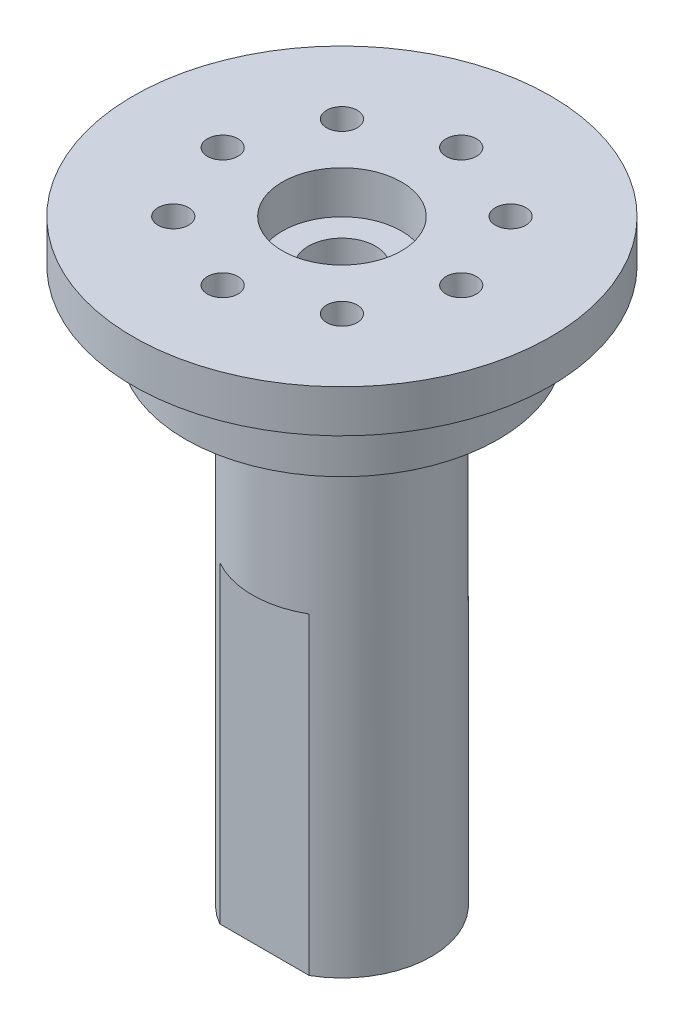
ISO-10303-21;
HEADER;
FILE_DESCRIPTION(('STEP AP214'),'2;1');
FILE_NAME('part.step','',(''),(''),'','','');
FILE_SCHEMA(('AUTOMOTIVE_DESIGN { 1 0 10303 214 1 1 1 1 }'));
ENDSEC;
DATA;
#1=APPLICATION_CONTEXT('core data for automotive mechanical design processes');
#2=APPLICATION_PROTOCOL_DEFINITION('international standard','automotive_design',2000,#1);
#3=PRODUCT_CONTEXT('',#1,'mechanical');
#4=PRODUCT('Part','Part','',(#3));
#5=PRODUCT_RELATED_PRODUCT_CATEGORY('part','',(#4));
#6=PRODUCT_DEFINITION_FORMATION('','',#4);
#7=PRODUCT_DEFINITION_CONTEXT('part definition',#1,'design');
#8=PRODUCT_DEFINITION('design','',#6,#7);
#9=PRODUCT_DEFINITION_SHAPE('','',#8);
#10=(LENGTH_UNIT() NAMED_UNIT(*) SI_UNIT(.MILLI.,.METRE.));
#11=(NAMED_UNIT(*) PLANE_ANGLE_UNIT() SI_UNIT($,.RADIAN.));
#12=(NAMED_UNIT(*) SI_UNIT($,.STERADIAN.) SOLID_ANGLE_UNIT());
#13=UNCERTAINTY_MEASURE_WITH_UNIT(LENGTH_MEASURE(1.E-05),#10,'distance_accuracy_value','');
#14=(GEOMETRIC_REPRESENTATION_CONTEXT(3) GLOBAL_UNCERTAINTY_ASSIGNED_CONTEXT((#13)) GLOBAL_UNIT_ASSIGNED_CONTEXT((#10,
#11,#12)) REPRESENTATION_CONTEXT('',''));
#15=CARTESIAN_POINT('',(0.,0.,0.));
#16=DIRECTION('',(0.,0.,1.));
#17=DIRECTION('',(1.,0.,0.));
#18=AXIS2_PLACEMENT_3D('',#15,#16,#17);
#19=CARTESIAN_POINT('',(-10.5,32.3,0.));
#20=DIRECTION('',(0.,1.,0.));
#21=DIRECTION('',(0.,0.,1.));
#22=AXIS2_PLACEMENT_3D('',#19,#20,#21);
#23=PLANE('',#22);
#24=CARTESIAN_POINT('',(0.,32.3,8.));
#25=DIRECTION('',(0.,-1.,0.));
#26=DIRECTION('',(0.,0.,-1.));
#27=AXIS2_PLACEMENT_3D('',#24,#25,#26);
#28=CIRCLE('',#27,1.02499999999999);
#29=CARTESIAN_POINT('',(0.,32.3,6.97500000000001));
#30=VERTEX_POINT('',#29);
#31=EDGE_CURVE('E86',#30,#30,#28,.T.);
#32=ORIENTED_EDGE('',*,*,#31,.F.);
#33=EDGE_LOOP('',(#32));
#34=FACE_BOUND('',#33,.T.);
#35=CARTESIAN_POINT('',(5.65685424949239,32.3,5.65685424949237));
#36=DIRECTION('',(0.,-1.,0.));
#37=DIRECTION('',(0.,0.,-1.));
#38=AXIS2_PLACEMENT_3D('',#35,#36,#37);
#39=CIRCLE('',#38,1.02499999999999);
#40=CARTESIAN_POINT('',(5.65685424949239,32.3,4.63185424949238));
#41=VERTEX_POINT('',#40);
#42=EDGE_CURVE('E333',#41,#41,#39,.T.);
#43=ORIENTED_EDGE('',*,*,#42,.F.);
#44=EDGE_LOOP('',(#43));
#45=FACE_BOUND('',#44,.T.);
#46=CARTESIAN_POINT('',(8.,32.3,0.));
#47=DIRECTION('',(0.,-1.,0.));
#48=DIRECTION('',(0.,0.,-1.));
#49=AXIS2_PLACEMENT_3D('',#46,#47,#48);
#50=CIRCLE('',#49,1.02499999999999);
#51=CARTESIAN_POINT('',(8.,32.3,-1.02500000000002));
#52=VERTEX_POINT('',#51);
#53=EDGE_CURVE('E341',#52,#52,#50,.T.);
#54=ORIENTED_EDGE('',*,*,#53,.F.);
#55=EDGE_LOOP('',(#54));
#56=FACE_BOUND('',#55,.T.);
#57=CARTESIAN_POINT('',(5.65685424949235,32.3,-5.65685424949241));
#58=DIRECTION('',(0.,-1.,0.));
#59=DIRECTION('',(0.,0.,-1.));
#60=AXIS2_PLACEMENT_3D('',#57,#58,#59);
#61=CIRCLE('',#60,1.02499999999999);
#62=CARTESIAN_POINT('',(5.65685424949235,32.3,-6.6818542494924));
#63=VERTEX_POINT('',#62);
#64=EDGE_CURVE('E349',#63,#63,#61,.T.);
#65=ORIENTED_EDGE('',*,*,#64,.F.);
#66=EDGE_LOOP('',(#65));
#67=FACE_BOUND('',#66,.T.);
#68=CARTESIAN_POINT('',(0.,32.3,-8.));
#69=DIRECTION('',(0.,-1.,0.));
#70=DIRECTION('',(0.,0.,-1.));
#71=AXIS2_PLACEMENT_3D('',#68,#69,#70);
#72=CIRCLE('',#71,1.02499999999999);
#73=CARTESIAN_POINT('',(0.,32.3,-9.02499999999999));
#74=VERTEX_POINT('',#73);
#75=EDGE_CURVE('E357',#74,#74,#72,.T.);
#76=ORIENTED_EDGE('',*,*,#75,.F.);
#77=EDGE_LOOP('',(#76));
#78=FACE_BOUND('',#77,.T.);
#79=CARTESIAN_POINT('',(-8.,32.3,0.));
#80=DIRECTION('',(0.,-1.,0.));
#81=DIRECTION('',(0.,0.,-1.));
#82=AXIS2_PLACEMENT_3D('',#79,#80,#81);
#83=CIRCLE('',#82,1.02499999999999);
#84=CARTESIAN_POINT('',(-8.,32.3,-1.0249999999999));
#85=VERTEX_POINT('',#84);
#86=EDGE_CURVE('E373',#85,#85,#83,.T.);
#87=ORIENTED_EDGE('',*,*,#86,.F.);
#88=EDGE_LOOP('',(#87));
#89=FACE_BOUND('',#88,.T.);
#90=CARTESIAN_POINT('',(-5.65685424949231,32.3,5.65685424949245));
#91=DIRECTION('',(0.,-1.,0.));
#92=DIRECTION('',(0.,0.,-1.));
#93=AXIS2_PLACEMENT_3D('',#90,#91,#92);
#94=CIRCLE('',#93,1.02499999999999);
#95=CARTESIAN_POINT('',(-5.65685424949231,32.3,4.63185424949246));
#96=VERTEX_POINT('',#95);
#97=EDGE_CURVE('E99',#96,#96,#94,.T.);
#98=ORIENTED_EDGE('',*,*,#97,.F.);
#99=EDGE_LOOP('',(#98));
#100=FACE_BOUND('',#99,.T.);
#101=CARTESIAN_POINT('',(0.,32.3,0.));
#102=DIRECTION('',(0.,-1.,0.));
#103=DIRECTION('',(0.,0.,-1.));
#104=AXIS2_PLACEMENT_3D('',#101,#102,#103);
#105=CIRCLE('',#104,6.);
#106=CARTESIAN_POINT('',(0.,32.3,-6.));
#107=VERTEX_POINT('',#106);
#108=EDGE_CURVE('E90',#107,#107,#105,.T.);
#109=ORIENTED_EDGE('',*,*,#108,.F.);
#110=EDGE_LOOP('',(#109));
#111=FACE_BOUND('',#110,.T.);
#112=CARTESIAN_POINT('',(0.,32.3,0.));
#113=DIRECTION('',(0.,-1.,0.));
#114=DIRECTION('',(0.,0.,-1.));
#115=AXIS2_PLACEMENT_3D('',#112,#113,#114);
#116=CIRCLE('',#115,10.5);
#117=CARTESIAN_POINT('',(0.,32.3,-10.5));
#118=VERTEX_POINT('',#117);
#119=EDGE_CURVE('E96',#118,#118,#116,.T.);
#120=ORIENTED_EDGE('',*,*,#119,.T.);
#121=EDGE_LOOP('',(#120));
#122=FACE_BOUND('',#121,.T.);
#123=CARTESIAN_POINT('',(-5.65685424949243,32.3,-5.65685424949233));
#124=DIRECTION('',(0.,-1.,0.));
#125=DIRECTION('',(0.,0.,-1.));
#126=AXIS2_PLACEMENT_3D('',#123,#124,#125);
#127=CIRCLE('',#126,1.02499999999999);
#128=CARTESIAN_POINT('',(-5.65685424949243,32.3,-6.68185424949232));
#129=VERTEX_POINT('',#128);
#130=EDGE_CURVE('E365',#129,#129,#127,.T.);
#131=ORIENTED_EDGE('',*,*,#130,.F.);
#132=EDGE_LOOP('',(#131));
#133=FACE_BOUND('',#132,.T.);
#134=ADVANCED_FACE('F45',(#34,#45,#56,#67,#78,#89,#100,#111,#122,#133),#23,.F.);
#135=CARTESIAN_POINT('',(-2.25,34.3,0.));
#136=DIRECTION('',(0.,-1.,0.));
#137=DIRECTION('',(0.,0.,-1.));
#138=AXIS2_PLACEMENT_3D('',#135,#136,#137);
#139=PLANE('',#138);
#140=CARTESIAN_POINT('',(0.,34.3,0.));
#141=DIRECTION('',(0.,-1.,0.));
#142=DIRECTION('',(0.,0.,-1.));
#143=AXIS2_PLACEMENT_3D('',#140,#141,#142);
#144=CIRCLE('',#143,2.25);
#145=CARTESIAN_POINT('',(0.,34.3,-2.25));
#146=VERTEX_POINT('',#145);
#147=EDGE_CURVE('E11',#146,#146,#144,.T.);
#148=ORIENTED_EDGE('',*,*,#147,.F.);
#149=EDGE_LOOP('',(#148));
#150=FACE_BOUND('',#149,.T.);
#151=ADVANCED_FACE('F47',(#150),#139,.F.);
#152=CARTESIAN_POINT('',(0.,0.,0.));
#153=DIRECTION('',(0.,-1.,0.));
#154=DIRECTION('',(0.,0.,-1.));
#155=AXIS2_PLACEMENT_3D('',#152,#153,#154);
#156=CYLINDRICAL_SURFACE('',#155,2.25);
#157=CARTESIAN_POINT('',(0.,37.15,0.));
#158=DIRECTION('',(0.,-1.,0.));
#159=DIRECTION('',(0.,0.,-1.));
#160=AXIS2_PLACEMENT_3D('',#157,#158,#159);
#161=CIRCLE('',#160,2.25);
#162=CARTESIAN_POINT('',(0.,37.15,-2.25));
#163=VERTEX_POINT('',#162);
#164=EDGE_CURVE('E54',#163,#163,#161,.T.);
#165=ORIENTED_EDGE('',*,*,#164,.F.);
#166=EDGE_LOOP('',(#165));
#167=FACE_BOUND('',#166,.T.);
#168=ORIENTED_EDGE('',*,*,#147,.T.);
#169=EDGE_LOOP('',(#168));
#170=FACE_BOUND('',#169,.T.);
#171=ADVANCED_FACE('F131',(#167,#170),#156,.F.);
#172=CARTESIAN_POINT('',(-4.,37.15,0.));
#173=DIRECTION('',(0.,-1.,0.));
#174=DIRECTION('',(0.,0.,-1.));
#175=AXIS2_PLACEMENT_3D('',#172,#173,#174);
#176=PLANE('',#175);
#177=CARTESIAN_POINT('',(0.,37.15,0.));
#178=DIRECTION('',(0.,-1.,0.));
#179=DIRECTION('',(0.,0.,-1.));
#180=AXIS2_PLACEMENT_3D('',#177,#178,#179);
#181=CIRCLE('',#180,4.);
#182=CARTESIAN_POINT('',(0.,37.15,-4.));
#183=VERTEX_POINT('',#182);
#184=EDGE_CURVE('E122',#183,#183,#181,.T.);
#185=ORIENTED_EDGE('',*,*,#184,.F.);
#186=EDGE_LOOP('',(#185));
#187=FACE_BOUND('',#186,.T.);
#188=ORIENTED_EDGE('',*,*,#164,.T.);
#189=EDGE_LOOP('',(#188));
#190=FACE_BOUND('',#189,.T.);
#191=ADVANCED_FACE('F129',(#187,#190),#176,.F.);
#192=CARTESIAN_POINT('',(0.,0.,0.));
#193=DIRECTION('',(0.,-1.,0.));
#194=DIRECTION('',(0.,0.,-1.));
#195=AXIS2_PLACEMENT_3D('',#192,#193,#194);
#196=CYLINDRICAL_SURFACE('',#195,4.);
#197=CARTESIAN_POINT('',(0.,40.,0.));
#198=DIRECTION('',(0.,-1.,0.));
#199=DIRECTION('',(0.,0.,-1.));
#200=AXIS2_PLACEMENT_3D('',#197,#198,#199);
#201=CIRCLE('',#200,4.);
#202=CARTESIAN_POINT('',(0.,40.,-4.));
#203=VERTEX_POINT('',#202);
#204=EDGE_CURVE('E118',#203,#203,#201,.T.);
#205=ORIENTED_EDGE('',*,*,#204,.F.);
#206=EDGE_LOOP('',(#205));
#207=FACE_BOUND('',#206,.T.);
#208=ORIENTED_EDGE('',*,*,#184,.T.);
#209=EDGE_LOOP('',(#208));
#210=FACE_BOUND('',#209,.T.);
#211=ADVANCED_FACE('F164',(#207,#210),#196,.F.);
#212=CARTESIAN_POINT('',(-14.,40.,0.));
#213=DIRECTION('',(0.,-1.,0.));
#214=DIRECTION('',(0.,0.,-1.));
#215=AXIS2_PLACEMENT_3D('',#212,#213,#214);
#216=PLANE('',#215);
#217=CARTESIAN_POINT('',(0.,40.,8.));
#218=DIRECTION('',(0.,-1.,0.));
#219=DIRECTION('',(0.,0.,-1.));
#220=AXIS2_PLACEMENT_3D('',#217,#218,#219);
#221=CIRCLE('',#220,1.025);
#222=CARTESIAN_POINT('',(0.,40.,6.975));
#223=VERTEX_POINT('',#222);
#224=EDGE_CURVE('E329',#223,#223,#221,.T.);
#225=ORIENTED_EDGE('',*,*,#224,.T.);
#226=EDGE_LOOP('',(#225));
#227=FACE_BOUND('',#226,.T.);
#228=CARTESIAN_POINT('',(5.65685424949239,40.,5.65685424949237));
#229=DIRECTION('',(0.,-1.,0.));
#230=DIRECTION('',(0.,0.,-1.));
#231=AXIS2_PLACEMENT_3D('',#228,#229,#230);
#232=CIRCLE('',#231,1.025);
#233=CARTESIAN_POINT('',(5.65685424949239,40.,4.63185424949237));
#234=VERTEX_POINT('',#233);
#235=EDGE_CURVE('E337',#234,#234,#232,.T.);
#236=ORIENTED_EDGE('',*,*,#235,.T.);
#237=EDGE_LOOP('',(#236));
#238=FACE_BOUND('',#237,.T.);
#239=CARTESIAN_POINT('',(8.,40.,0.));
#240=DIRECTION('',(0.,-1.,0.));
#241=DIRECTION('',(0.,0.,-1.));
#242=AXIS2_PLACEMENT_3D('',#239,#240,#241);
#243=CIRCLE('',#242,1.025);
#244=CARTESIAN_POINT('',(8.,40.,-1.02500000000003));
#245=VERTEX_POINT('',#244);
#246=EDGE_CURVE('E345',#245,#245,#243,.T.);
#247=ORIENTED_EDGE('',*,*,#246,.T.);
#248=EDGE_LOOP('',(#247));
#249=FACE_BOUND('',#248,.T.);
#250=CARTESIAN_POINT('',(5.65685424949235,40.,-5.65685424949241));
#251=DIRECTION('',(0.,-1.,0.));
#252=DIRECTION('',(0.,0.,-1.));
#253=AXIS2_PLACEMENT_3D('',#250,#251,#252);
#254=CIRCLE('',#253,1.025);
#255=CARTESIAN_POINT('',(5.65685424949235,40.,-6.68185424949241));
#256=VERTEX_POINT('',#255);
#257=EDGE_CURVE('E353',#256,#256,#254,.T.);
#258=ORIENTED_EDGE('',*,*,#257,.T.);
#259=EDGE_LOOP('',(#258));
#260=FACE_BOUND('',#259,.T.);
#261=CARTESIAN_POINT('',(0.,40.,-8.));
#262=DIRECTION('',(0.,-1.,0.));
#263=DIRECTION('',(0.,0.,-1.));
#264=AXIS2_PLACEMENT_3D('',#261,#262,#263);
#265=CIRCLE('',#264,1.025);
#266=CARTESIAN_POINT('',(0.,40.,-9.025));
#267=VERTEX_POINT('',#266);
#268=EDGE_CURVE('E361',#267,#267,#265,.T.);
#269=ORIENTED_EDGE('',*,*,#268,.T.);
#270=EDGE_LOOP('',(#269));
#271=FACE_BOUND('',#270,.T.);
#272=CARTESIAN_POINT('',(-5.65685424949243,40.,-5.65685424949233));
#273=DIRECTION('',(0.,-1.,0.));
#274=DIRECTION('',(0.,0.,-1.));
#275=AXIS2_PLACEMENT_3D('',#272,#273,#274);
#276=CIRCLE('',#275,1.025);
#277=CARTESIAN_POINT('',(-5.65685424949243,40.,-6.68185424949233));
#278=VERTEX_POINT('',#277);
#279=EDGE_CURVE('E369',#278,#278,#276,.T.);
#280=ORIENTED_EDGE('',*,*,#279,.T.);
#281=EDGE_LOOP('',(#280));
#282=FACE_BOUND('',#281,.T.);
#283=CARTESIAN_POINT('',(-8.,40.,0.));
#284=DIRECTION('',(0.,-1.,0.));
#285=DIRECTION('',(0.,0.,-1.));
#286=AXIS2_PLACEMENT_3D('',#283,#284,#285);
#287=CIRCLE('',#286,1.025);
#288=CARTESIAN_POINT('',(-8.,40.,-1.02499999999991));
#289=VERTEX_POINT('',#288);
#290=EDGE_CURVE('E377',#289,#289,#287,.T.);
#291=ORIENTED_EDGE('',*,*,#290,.T.);
#292=EDGE_LOOP('',(#291));
#293=FACE_BOUND('',#292,.T.);
#294=CARTESIAN_POINT('',(-5.65685424949231,40.,5.65685424949245));
#295=DIRECTION('',(0.,-1.,0.));
#296=DIRECTION('',(0.,0.,-1.));
#297=AXIS2_PLACEMENT_3D('',#294,#295,#296);
#298=CIRCLE('',#297,1.025);
#299=CARTESIAN_POINT('',(-5.65685424949231,40.,4.63185424949245));
#300=VERTEX_POINT('',#299);
#301=EDGE_CURVE('E91',#300,#300,#298,.T.);
#302=ORIENTED_EDGE('',*,*,#301,.T.);
#303=EDGE_LOOP('',(#302));
#304=FACE_BOUND('',#303,.T.);
#305=CARTESIAN_POINT('',(0.,40.,0.));
#306=DIRECTION('',(0.,-1.,0.));
#307=DIRECTION('',(0.,0.,-1.));
#308=AXIS2_PLACEMENT_3D('',#305,#306,#307);
#309=CIRCLE('',#308,14.);
#310=CARTESIAN_POINT('',(0.,40.,-14.));
#311=VERTEX_POINT('',#310);
#312=EDGE_CURVE('E114',#311,#311,#309,.T.);
#313=ORIENTED_EDGE('',*,*,#312,.F.);
#314=EDGE_LOOP('',(#313));
#315=FACE_BOUND('',#314,.T.);
#316=ORIENTED_EDGE('',*,*,#204,.T.);
#317=EDGE_LOOP('',(#316));
#318=FACE_BOUND('',#317,.T.);
#319=ADVANCED_FACE('F161',(#227,#238,#249,#260,#271,#282,#293,#304,#315,#318),#216,.F.);
#320=CARTESIAN_POINT('',(0.,0.,0.));
#321=DIRECTION('',(0.,-1.,0.));
#322=DIRECTION('',(0.,0.,-1.));
#323=AXIS2_PLACEMENT_3D('',#320,#321,#322);
#324=CYLINDRICAL_SURFACE('',#323,14.);
#325=CARTESIAN_POINT('',(0.,37.15,0.));
#326=DIRECTION('',(0.,-1.,0.));
#327=DIRECTION('',(0.,0.,-1.));
#328=AXIS2_PLACEMENT_3D('',#325,#326,#327);
#329=CIRCLE('',#328,14.);
#330=CARTESIAN_POINT('',(0.,37.15,-14.));
#331=VERTEX_POINT('',#330);
#332=EDGE_CURVE('E110',#331,#331,#329,.T.);
#333=ORIENTED_EDGE('',*,*,#332,.F.);
#334=EDGE_LOOP('',(#333));
#335=FACE_BOUND('',#334,.T.);
#336=ORIENTED_EDGE('',*,*,#312,.T.);
#337=EDGE_LOOP('',(#336));
#338=FACE_BOUND('',#337,.T.);
#339=ADVANCED_FACE('F157',(#335,#338),#324,.T.);
#340=CARTESIAN_POINT('',(-10.5,37.15,0.));
#341=DIRECTION('',(0.,1.,0.));
#342=DIRECTION('',(0.,0.,1.));
#343=AXIS2_PLACEMENT_3D('',#340,#341,#342);
#344=PLANE('',#343);
#345=CARTESIAN_POINT('',(0.,37.15,0.));
#346=DIRECTION('',(0.,-1.,0.));
#347=DIRECTION('',(0.,0.,-1.));
#348=AXIS2_PLACEMENT_3D('',#345,#346,#347);
#349=CIRCLE('',#348,10.5);
#350=CARTESIAN_POINT('',(0.,37.15,-10.5));
#351=VERTEX_POINT('',#350);
#352=EDGE_CURVE('E106',#351,#351,#349,.T.);
#353=ORIENTED_EDGE('',*,*,#352,.F.);
#354=EDGE_LOOP('',(#353));
#355=FACE_BOUND('',#354,.T.);
#356=ORIENTED_EDGE('',*,*,#332,.T.);
#357=EDGE_LOOP('',(#356));
#358=FACE_BOUND('',#357,.T.);
#359=ADVANCED_FACE('F153',(#355,#358),#344,.F.);
#360=CARTESIAN_POINT('',(0.,0.,0.));
#361=DIRECTION('',(0.,-1.,0.));
#362=DIRECTION('',(0.,0.,-1.));
#363=AXIS2_PLACEMENT_3D('',#360,#361,#362);
#364=CYLINDRICAL_SURFACE('',#363,10.5);
#365=ORIENTED_EDGE('',*,*,#119,.F.);
#366=EDGE_LOOP('',(#365));
#367=FACE_BOUND('',#366,.T.);
#368=ORIENTED_EDGE('',*,*,#352,.T.);
#369=EDGE_LOOP('',(#368));
#370=FACE_BOUND('',#369,.T.);
#371=ADVANCED_FACE('F151',(#367,#370),#364,.T.);
#372=CARTESIAN_POINT('',(0.,0.,0.));
#373=DIRECTION('',(0.,-1.,0.));
#374=DIRECTION('',(0.,0.,-1.));
#375=AXIS2_PLACEMENT_3D('',#372,#373,#374);
#376=CYLINDRICAL_SURFACE('',#375,6.);
#377=CARTESIAN_POINT('',(0.,21.,0.));
#378=DIRECTION('',(0.,-1.,0.));
#379=DIRECTION('',(0.,0.,-1.));
#380=AXIS2_PLACEMENT_3D('',#377,#378,#379);
#381=CIRCLE('',#380,6.);
#382=CARTESIAN_POINT('',(2.99999999999999,21.,5.19615242270663));
#383=VERTEX_POINT('',#382);
#384=CARTESIAN_POINT('',(-2.99999999999999,21.,5.19615242270663));
#385=VERTEX_POINT('',#384);
#386=EDGE_CURVE('E78',#383,#385,#381,.T.);
#387=ORIENTED_EDGE('',*,*,#386,.F.);
#388=DIRECTION('',(0.,-1.,0.));
#389=VECTOR('',#388,1.);
#390=CARTESIAN_POINT('',(2.99999999999999,21.,5.19615242270663));
#391=LINE('',#390,#389);
#392=CARTESIAN_POINT('',(2.99999999999999,0.,5.19615242270663));
#393=VERTEX_POINT('',#392);
#394=EDGE_CURVE('E67',#383,#393,#391,.T.);
#395=ORIENTED_EDGE('',*,*,#394,.T.);
#396=CARTESIAN_POINT('',(0.,0.,0.));
#397=DIRECTION('',(0.,-1.,0.));
#398=DIRECTION('',(0.,0.,-1.));
#399=AXIS2_PLACEMENT_3D('',#396,#397,#398);
#400=CIRCLE('',#399,6.);
#401=CARTESIAN_POINT('',(-2.99999999999999,0.,5.19615242270663));
#402=VERTEX_POINT('',#401);
#403=EDGE_CURVE('E84',#402,#393,#400,.T.);
#404=ORIENTED_EDGE('',*,*,#403,.F.);
#405=DIRECTION('',(0.,-1.,0.));
#406=VECTOR('',#405,1.);
#407=CARTESIAN_POINT('',(-2.99999999999999,21.,5.19615242270663));
#408=LINE('',#407,#406);
#409=EDGE_CURVE('E61',#385,#402,#408,.T.);
#410=ORIENTED_EDGE('',*,*,#409,.F.);
#411=EDGE_LOOP('',(#387,#395,#404,#410));
#412=FACE_BOUND('',#411,.T.);
#413=ORIENTED_EDGE('',*,*,#108,.T.);
#414=EDGE_LOOP('',(#413));
#415=FACE_BOUND('',#414,.T.);
#416=ADVANCED_FACE('F82',(#412,#415),#376,.T.);
#417=CARTESIAN_POINT('',(-6.,0.,0.));
#418=DIRECTION('',(0.,1.,0.));
#419=DIRECTION('',(0.,0.,1.));
#420=AXIS2_PLACEMENT_3D('',#417,#418,#419);
#421=PLANE('',#420);
#422=ORIENTED_EDGE('',*,*,#403,.T.);
#423=DIRECTION('',(1.,0.,0.));
#424=VECTOR('',#423,1.);
#425=CARTESIAN_POINT('',(0.,0.,5.19615242270663));
#426=LINE('',#425,#424);
#427=EDGE_CURVE('E72',#402,#393,#426,.T.);
#428=ORIENTED_EDGE('',*,*,#427,.F.);
#429=EDGE_LOOP('',(#422,#428));
#430=FACE_BOUND('',#429,.T.);
#431=ADVANCED_FACE('F88',(#430),#421,.F.);
#432=CARTESIAN_POINT('',(-5.65685424949231,32.3,5.65685424949245));
#433=DIRECTION('',(0.,-1.,0.));
#434=DIRECTION('',(0.,0.,-1.));
#435=AXIS2_PLACEMENT_3D('',#432,#433,#434);
#436=CYLINDRICAL_SURFACE('',#435,1.02499999999999);
#437=ORIENTED_EDGE('',*,*,#301,.F.);
#438=EDGE_LOOP('',(#437));
#439=FACE_BOUND('',#438,.T.);
#440=ORIENTED_EDGE('',*,*,#97,.T.);
#441=EDGE_LOOP('',(#440));
#442=FACE_BOUND('',#441,.T.);
#443=ADVANCED_FACE('F216',(#439,#442),#436,.F.);
#444=CARTESIAN_POINT('',(-8.,32.3,0.));
#445=DIRECTION('',(0.,-1.,0.));
#446=DIRECTION('',(0.,0.,-1.));
#447=AXIS2_PLACEMENT_3D('',#444,#445,#446);
#448=CYLINDRICAL_SURFACE('',#447,1.02499999999999);
#449=ORIENTED_EDGE('',*,*,#290,.F.);
#450=EDGE_LOOP('',(#449));
#451=FACE_BOUND('',#450,.T.);
#452=ORIENTED_EDGE('',*,*,#86,.T.);
#453=EDGE_LOOP('',(#452));
#454=FACE_BOUND('',#453,.T.);
#455=ADVANCED_FACE('F229',(#451,#454),#448,.F.);
#456=CARTESIAN_POINT('',(-5.65685424949243,32.3,-5.65685424949233));
#457=DIRECTION('',(0.,-1.,0.));
#458=DIRECTION('',(0.,0.,-1.));
#459=AXIS2_PLACEMENT_3D('',#456,#457,#458);
#460=CYLINDRICAL_SURFACE('',#459,1.02499999999999);
#461=ORIENTED_EDGE('',*,*,#279,.F.);
#462=EDGE_LOOP('',(#461));
#463=FACE_BOUND('',#462,.T.);
#464=ORIENTED_EDGE('',*,*,#130,.T.);
#465=EDGE_LOOP('',(#464));
#466=FACE_BOUND('',#465,.T.);
#467=ADVANCED_FACE('F239',(#463,#466),#460,.F.);
#468=CARTESIAN_POINT('',(0.,32.3,-8.));
#469=DIRECTION('',(0.,-1.,0.));
#470=DIRECTION('',(0.,0.,-1.));
#471=AXIS2_PLACEMENT_3D('',#468,#469,#470);
#472=CYLINDRICAL_SURFACE('',#471,1.02499999999999);
#473=ORIENTED_EDGE('',*,*,#268,.F.);
#474=EDGE_LOOP('',(#473));
#475=FACE_BOUND('',#474,.T.);
#476=ORIENTED_EDGE('',*,*,#75,.T.);
#477=EDGE_LOOP('',(#476));
#478=FACE_BOUND('',#477,.T.);
#479=ADVANCED_FACE('F249',(#475,#478),#472,.F.);
#480=CARTESIAN_POINT('',(5.65685424949235,32.3,-5.65685424949241));
#481=DIRECTION('',(0.,-1.,0.));
#482=DIRECTION('',(0.,0.,-1.));
#483=AXIS2_PLACEMENT_3D('',#480,#481,#482);
#484=CYLINDRICAL_SURFACE('',#483,1.02499999999999);
#485=ORIENTED_EDGE('',*,*,#257,.F.);
#486=EDGE_LOOP('',(#485));
#487=FACE_BOUND('',#486,.T.);
#488=ORIENTED_EDGE('',*,*,#64,.T.);
#489=EDGE_LOOP('',(#488));
#490=FACE_BOUND('',#489,.T.);
#491=ADVANCED_FACE('F259',(#487,#490),#484,.F.);
#492=CARTESIAN_POINT('',(8.,32.3,0.));
#493=DIRECTION('',(0.,-1.,0.));
#494=DIRECTION('',(0.,0.,-1.));
#495=AXIS2_PLACEMENT_3D('',#492,#493,#494);
#496=CYLINDRICAL_SURFACE('',#495,1.02499999999999);
#497=ORIENTED_EDGE('',*,*,#246,.F.);
#498=EDGE_LOOP('',(#497));
#499=FACE_BOUND('',#498,.T.);
#500=ORIENTED_EDGE('',*,*,#53,.T.);
#501=EDGE_LOOP('',(#500));
#502=FACE_BOUND('',#501,.T.);
#503=ADVANCED_FACE('F269',(#499,#502),#496,.F.);
#504=CARTESIAN_POINT('',(5.65685424949239,32.3,5.65685424949237));
#505=DIRECTION('',(0.,-1.,0.));
#506=DIRECTION('',(0.,0.,-1.));
#507=AXIS2_PLACEMENT_3D('',#504,#505,#506);
#508=CYLINDRICAL_SURFACE('',#507,1.02499999999999);
#509=ORIENTED_EDGE('',*,*,#235,.F.);
#510=EDGE_LOOP('',(#509));
#511=FACE_BOUND('',#510,.T.);
#512=ORIENTED_EDGE('',*,*,#42,.T.);
#513=EDGE_LOOP('',(#512));
#514=FACE_BOUND('',#513,.T.);
#515=ADVANCED_FACE('F279',(#511,#514),#508,.F.);
#516=CARTESIAN_POINT('',(0.,32.3,8.));
#517=DIRECTION('',(0.,-1.,0.));
#518=DIRECTION('',(0.,0.,-1.));
#519=AXIS2_PLACEMENT_3D('',#516,#517,#518);
#520=CYLINDRICAL_SURFACE('',#519,1.02499999999999);
#521=ORIENTED_EDGE('',*,*,#224,.F.);
#522=EDGE_LOOP('',(#521));
#523=FACE_BOUND('',#522,.T.);
#524=ORIENTED_EDGE('',*,*,#31,.T.);
#525=EDGE_LOOP('',(#524));
#526=FACE_BOUND('',#525,.T.);
#527=ADVANCED_FACE('F289',(#523,#526),#520,.F.);
#528=CARTESIAN_POINT('',(0.,21.,5.19615242270663));
#529=DIRECTION('',(0.,0.,-1.));
#530=DIRECTION('',(-1.,0.,0.));
#531=AXIS2_PLACEMENT_3D('',#528,#529,#530);
#532=PLANE('',#531);
#533=ORIENTED_EDGE('',*,*,#427,.T.);
#534=ORIENTED_EDGE('',*,*,#394,.F.);
#535=DIRECTION('',(1.,0.,0.));
#536=VECTOR('',#535,1.);
#537=CARTESIAN_POINT('',(0.,21.,5.19615242270663));
#538=LINE('',#537,#536);
#539=EDGE_CURVE('E318',#385,#383,#538,.T.);
#540=ORIENTED_EDGE('',*,*,#539,.F.);
#541=ORIENTED_EDGE('',*,*,#409,.T.);
#542=EDGE_LOOP('',(#533,#534,#540,#541));
#543=FACE_BOUND('',#542,.T.);
#544=ADVANCED_FACE('F73',(#543),#532,.F.);
#545=CARTESIAN_POINT('',(0.,21.,0.));
#546=DIRECTION('',(0.,-1.,0.));
#547=DIRECTION('',(0.,0.,-1.));
#548=AXIS2_PLACEMENT_3D('',#545,#546,#547);
#549=PLANE('',#548);
#550=ORIENTED_EDGE('',*,*,#386,.T.);
#551=ORIENTED_EDGE('',*,*,#539,.T.);
#552=EDGE_LOOP('',(#550,#551));
#553=FACE_BOUND('',#552,.T.);
#554=ADVANCED_FACE('F306',(#553),#549,.T.);
#555=CLOSED_SHELL('',(#134,#151,#171,#191,#211,#319,#339,#359,#371,#416,#431,#443,#455,#467,
#479,#491,#503,#515,#527,#544,#554));
#556=MANIFOLD_SOLID_BREP('B2',#555);
#557=ADVANCED_BREP_SHAPE_REPRESENTATION('',(#18,#556),#14);
#558=SHAPE_DEFINITION_REPRESENTATION(#9,#557);
ENDSEC;
END-ISO-10303-21;
